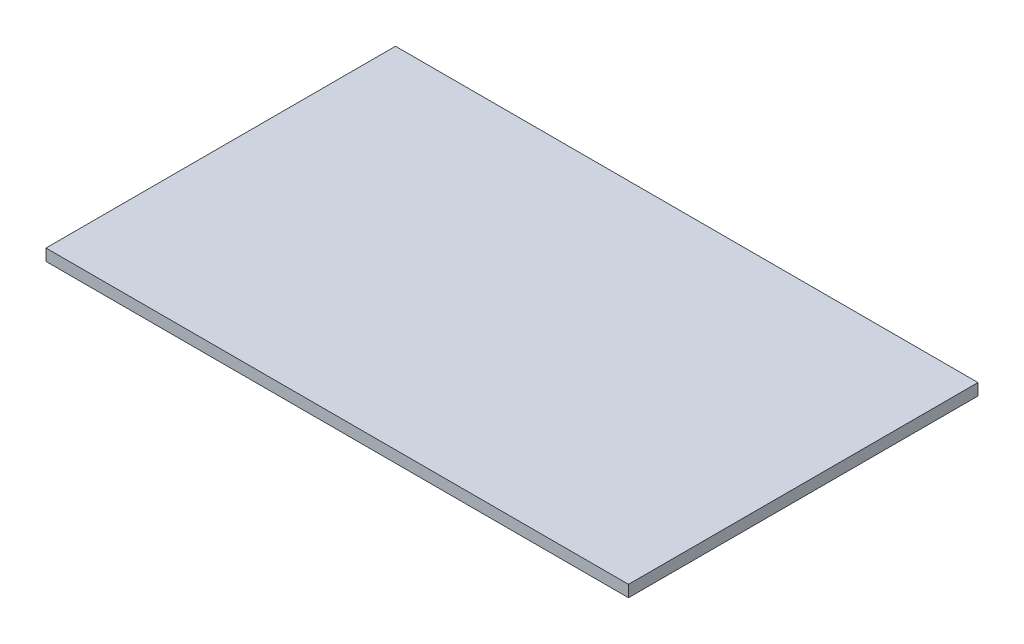
ISO-10303-21;
HEADER;
FILE_DESCRIPTION(('STEP AP214'),'2;1');
FILE_NAME('part.step','',(''),(''),'','','');
FILE_SCHEMA(('AUTOMOTIVE_DESIGN { 1 0 10303 214 1 1 1 1 }'));
ENDSEC;
DATA;
#1=APPLICATION_CONTEXT('core data for automotive mechanical design processes');
#2=APPLICATION_PROTOCOL_DEFINITION('international standard','automotive_design',2000,#1);
#3=PRODUCT_CONTEXT('',#1,'mechanical');
#4=PRODUCT('Part','Part','',(#3));
#5=PRODUCT_RELATED_PRODUCT_CATEGORY('part','',(#4));
#6=PRODUCT_DEFINITION_FORMATION('','',#4);
#7=PRODUCT_DEFINITION_CONTEXT('part definition',#1,'design');
#8=PRODUCT_DEFINITION('design','',#6,#7);
#9=PRODUCT_DEFINITION_SHAPE('','',#8);
#10=(LENGTH_UNIT() NAMED_UNIT(*) SI_UNIT(.MILLI.,.METRE.));
#11=(NAMED_UNIT(*) PLANE_ANGLE_UNIT() SI_UNIT($,.RADIAN.));
#12=(NAMED_UNIT(*) SI_UNIT($,.STERADIAN.) SOLID_ANGLE_UNIT());
#13=UNCERTAINTY_MEASURE_WITH_UNIT(LENGTH_MEASURE(1.E-05),#10,'distance_accuracy_value','');
#14=(GEOMETRIC_REPRESENTATION_CONTEXT(3) GLOBAL_UNCERTAINTY_ASSIGNED_CONTEXT((#13)) GLOBAL_UNIT_ASSIGNED_CONTEXT((#10,
#11,#12)) REPRESENTATION_CONTEXT('',''));
#15=CARTESIAN_POINT('',(0.,0.,0.));
#16=DIRECTION('',(0.,0.,1.));
#17=DIRECTION('',(1.,0.,0.));
#18=AXIS2_PLACEMENT_3D('',#15,#16,#17);
#19=CARTESIAN_POINT('',(-250.,10.,150.));
#20=DIRECTION('',(1.,0.,0.));
#21=DIRECTION('',(0.,0.,-1.));
#22=AXIS2_PLACEMENT_3D('',#19,#20,#21);
#23=PLANE('',#22);
#24=DIRECTION('',(0.,0.,1.));
#25=VECTOR('',#24,1.);
#26=CARTESIAN_POINT('',(-250.,0.,150.));
#27=LINE('',#26,#25);
#28=CARTESIAN_POINT('',(-250.,0.,-150.));
#29=VERTEX_POINT('',#28);
#30=CARTESIAN_POINT('',(-250.,0.,150.));
#31=VERTEX_POINT('',#30);
#32=EDGE_CURVE('E111',#29,#31,#27,.T.);
#33=ORIENTED_EDGE('',*,*,#32,.T.);
#34=DIRECTION('',(0.,-1.,0.));
#35=VECTOR('',#34,1.);
#36=CARTESIAN_POINT('',(-250.,10.,150.));
#37=LINE('',#36,#35);
#38=CARTESIAN_POINT('',(-250.,10.,150.));
#39=VERTEX_POINT('',#38);
#40=EDGE_CURVE('E11',#39,#31,#37,.T.);
#41=ORIENTED_EDGE('',*,*,#40,.F.);
#42=DIRECTION('',(0.,0.,1.));
#43=VECTOR('',#42,1.);
#44=CARTESIAN_POINT('',(-250.,10.,150.));
#45=LINE('',#44,#43);
#46=CARTESIAN_POINT('',(-250.,10.,-150.));
#47=VERTEX_POINT('',#46);
#48=EDGE_CURVE('E100',#47,#39,#45,.T.);
#49=ORIENTED_EDGE('',*,*,#48,.F.);
#50=DIRECTION('',(0.,-1.,0.));
#51=VECTOR('',#50,1.);
#52=CARTESIAN_POINT('',(-250.,10.,-150.));
#53=LINE('',#52,#51);
#54=EDGE_CURVE('E108',#47,#29,#53,.T.);
#55=ORIENTED_EDGE('',*,*,#54,.T.);
#56=EDGE_LOOP('',(#33,#41,#49,#55));
#57=FACE_BOUND('',#56,.T.);
#58=ADVANCED_FACE('F44',(#57),#23,.F.);
#59=CARTESIAN_POINT('',(250.,10.,150.));
#60=DIRECTION('',(0.,0.,-1.));
#61=DIRECTION('',(-1.,0.,0.));
#62=AXIS2_PLACEMENT_3D('',#59,#60,#61);
#63=PLANE('',#62);
#64=DIRECTION('',(1.,0.,0.));
#65=VECTOR('',#64,1.);
#66=CARTESIAN_POINT('',(250.,0.,150.));
#67=LINE('',#66,#65);
#68=CARTESIAN_POINT('',(250.,0.,150.));
#69=VERTEX_POINT('',#68);
#70=EDGE_CURVE('E105',#31,#69,#67,.T.);
#71=ORIENTED_EDGE('',*,*,#70,.T.);
#72=DIRECTION('',(0.,-1.,0.));
#73=VECTOR('',#72,1.);
#74=CARTESIAN_POINT('',(250.,10.,150.));
#75=LINE('',#74,#73);
#76=CARTESIAN_POINT('',(250.,10.,150.));
#77=VERTEX_POINT('',#76);
#78=EDGE_CURVE('E53',#77,#69,#75,.T.);
#79=ORIENTED_EDGE('',*,*,#78,.F.);
#80=DIRECTION('',(1.,0.,0.));
#81=VECTOR('',#80,1.);
#82=CARTESIAN_POINT('',(250.,10.,150.));
#83=LINE('',#82,#81);
#84=EDGE_CURVE('E95',#39,#77,#83,.T.);
#85=ORIENTED_EDGE('',*,*,#84,.F.);
#86=ORIENTED_EDGE('',*,*,#40,.T.);
#87=EDGE_LOOP('',(#71,#79,#85,#86));
#88=FACE_BOUND('',#87,.T.);
#89=ADVANCED_FACE('F102',(#88),#63,.F.);
#90=CARTESIAN_POINT('',(250.,10.,150.));
#91=DIRECTION('',(-1.,0.,0.));
#92=DIRECTION('',(0.,0.,1.));
#93=AXIS2_PLACEMENT_3D('',#90,#91,#92);
#94=PLANE('',#93);
#95=DIRECTION('',(0.,0.,-1.));
#96=VECTOR('',#95,1.);
#97=CARTESIAN_POINT('',(250.,0.,150.));
#98=LINE('',#97,#96);
#99=CARTESIAN_POINT('',(250.,0.,-150.));
#100=VERTEX_POINT('',#99);
#101=EDGE_CURVE('E80',#69,#100,#98,.T.);
#102=ORIENTED_EDGE('',*,*,#101,.T.);
#103=DIRECTION('',(0.,-1.,0.));
#104=VECTOR('',#103,1.);
#105=CARTESIAN_POINT('',(250.,10.,-150.));
#106=LINE('',#105,#104);
#107=CARTESIAN_POINT('',(250.,10.,-150.));
#108=VERTEX_POINT('',#107);
#109=EDGE_CURVE('E101',#108,#100,#106,.T.);
#110=ORIENTED_EDGE('',*,*,#109,.F.);
#111=DIRECTION('',(0.,0.,-1.));
#112=VECTOR('',#111,1.);
#113=CARTESIAN_POINT('',(250.,10.,150.));
#114=LINE('',#113,#112);
#115=EDGE_CURVE('E94',#77,#108,#114,.T.);
#116=ORIENTED_EDGE('',*,*,#115,.F.);
#117=ORIENTED_EDGE('',*,*,#78,.T.);
#118=EDGE_LOOP('',(#102,#110,#116,#117));
#119=FACE_BOUND('',#118,.T.);
#120=ADVANCED_FACE('F103',(#119),#94,.F.);
#121=CARTESIAN_POINT('',(250.,10.,-150.));
#122=DIRECTION('',(0.,0.,1.));
#123=DIRECTION('',(1.,0.,0.));
#124=AXIS2_PLACEMENT_3D('',#121,#122,#123);
#125=PLANE('',#124);
#126=DIRECTION('',(-1.,0.,0.));
#127=VECTOR('',#126,1.);
#128=CARTESIAN_POINT('',(250.,0.,-150.));
#129=LINE('',#128,#127);
#130=EDGE_CURVE('E82',#100,#29,#129,.T.);
#131=ORIENTED_EDGE('',*,*,#130,.T.);
#132=ORIENTED_EDGE('',*,*,#54,.F.);
#133=DIRECTION('',(-1.,0.,0.));
#134=VECTOR('',#133,1.);
#135=CARTESIAN_POINT('',(250.,10.,-150.));
#136=LINE('',#135,#134);
#137=EDGE_CURVE('E62',#108,#47,#136,.T.);
#138=ORIENTED_EDGE('',*,*,#137,.F.);
#139=ORIENTED_EDGE('',*,*,#109,.T.);
#140=EDGE_LOOP('',(#131,#132,#138,#139));
#141=FACE_BOUND('',#140,.T.);
#142=ADVANCED_FACE('F128',(#141),#125,.F.);
#143=CARTESIAN_POINT('',(0.,10.,0.));
#144=DIRECTION('',(0.,1.,0.));
#145=DIRECTION('',(0.,0.,1.));
#146=AXIS2_PLACEMENT_3D('',#143,#144,#145);
#147=PLANE('',#146);
#148=ORIENTED_EDGE('',*,*,#48,.T.);
#149=ORIENTED_EDGE('',*,*,#84,.T.);
#150=ORIENTED_EDGE('',*,*,#115,.T.);
#151=ORIENTED_EDGE('',*,*,#137,.T.);
#152=EDGE_LOOP('',(#148,#149,#150,#151));
#153=FACE_BOUND('',#152,.T.);
#154=ADVANCED_FACE('F93',(#153),#147,.T.);
#155=CARTESIAN_POINT('',(0.,0.,0.));
#156=DIRECTION('',(0.,1.,0.));
#157=DIRECTION('',(0.,0.,1.));
#158=AXIS2_PLACEMENT_3D('',#155,#156,#157);
#159=PLANE('',#158);
#160=ORIENTED_EDGE('',*,*,#32,.F.);
#161=ORIENTED_EDGE('',*,*,#130,.F.);
#162=ORIENTED_EDGE('',*,*,#101,.F.);
#163=ORIENTED_EDGE('',*,*,#70,.F.);
#164=EDGE_LOOP('',(#160,#161,#162,#163));
#165=FACE_BOUND('',#164,.T.);
#166=ADVANCED_FACE('F129',(#165),#159,.F.);
#167=CLOSED_SHELL('',(#58,#89,#120,#142,#154,#166));
#168=MANIFOLD_SOLID_BREP('B2',#167);
#169=ADVANCED_BREP_SHAPE_REPRESENTATION('',(#18,#168),#14);
#170=SHAPE_DEFINITION_REPRESENTATION(#9,#169);
ENDSEC;
END-ISO-10303-21;
